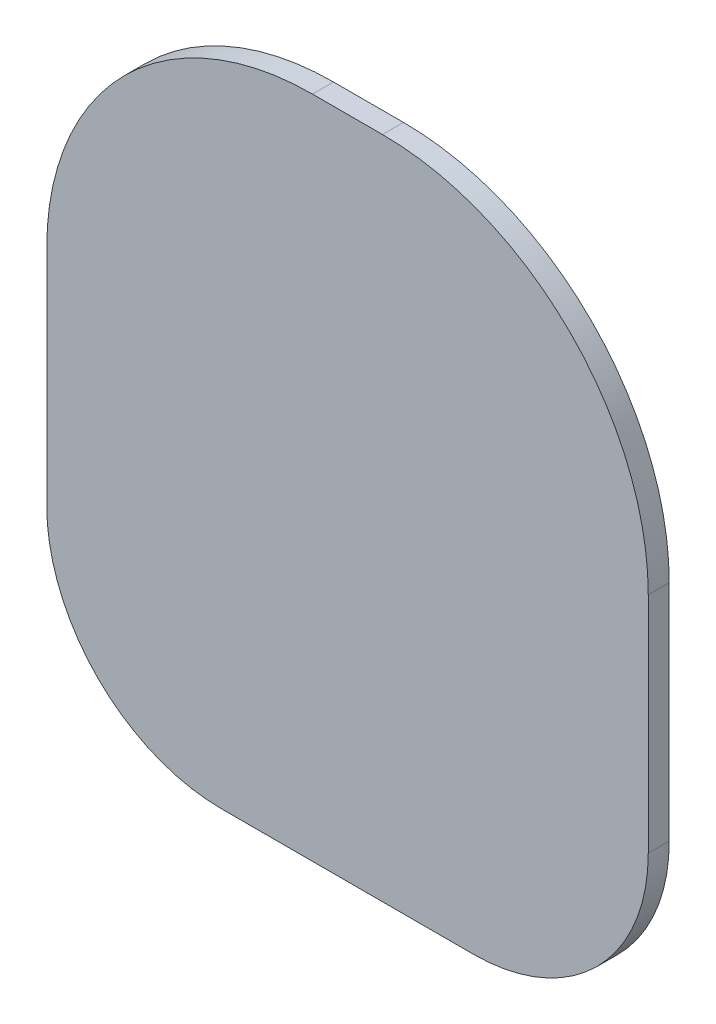
ISO-10303-21;
HEADER;
FILE_DESCRIPTION(('STEP AP214'),'2;1');
FILE_NAME('part.step','',(''),(''),'','','');
FILE_SCHEMA(('AUTOMOTIVE_DESIGN { 1 0 10303 214 1 1 1 1 }'));
ENDSEC;
DATA;
#1=APPLICATION_CONTEXT('core data for automotive mechanical design processes');
#2=APPLICATION_PROTOCOL_DEFINITION('international standard','automotive_design',2000,#1);
#3=PRODUCT_CONTEXT('',#1,'mechanical');
#4=PRODUCT('Part','Part','',(#3));
#5=PRODUCT_RELATED_PRODUCT_CATEGORY('part','',(#4));
#6=PRODUCT_DEFINITION_FORMATION('','',#4);
#7=PRODUCT_DEFINITION_CONTEXT('part definition',#1,'design');
#8=PRODUCT_DEFINITION('design','',#6,#7);
#9=PRODUCT_DEFINITION_SHAPE('','',#8);
#10=(LENGTH_UNIT() NAMED_UNIT(*) SI_UNIT(.MILLI.,.METRE.));
#11=(NAMED_UNIT(*) PLANE_ANGLE_UNIT() SI_UNIT($,.RADIAN.));
#12=(NAMED_UNIT(*) SI_UNIT($,.STERADIAN.) SOLID_ANGLE_UNIT());
#13=UNCERTAINTY_MEASURE_WITH_UNIT(LENGTH_MEASURE(1.E-05),#10,'distance_accuracy_value','');
#14=(GEOMETRIC_REPRESENTATION_CONTEXT(3) GLOBAL_UNCERTAINTY_ASSIGNED_CONTEXT((#13)) GLOBAL_UNIT_ASSIGNED_CONTEXT((#10,
#11,#12)) REPRESENTATION_CONTEXT('',''));
#15=CARTESIAN_POINT('',(0.,0.,0.));
#16=DIRECTION('',(0.,0.,1.));
#17=DIRECTION('',(1.,0.,0.));
#18=AXIS2_PLACEMENT_3D('',#15,#16,#17);
#19=CARTESIAN_POINT('',(-4.99999999999999,-29.5,3.));
#20=DIRECTION('',(0.,0.,-1.));
#21=DIRECTION('',(-1.,0.,0.));
#22=AXIS2_PLACEMENT_3D('',#19,#20,#21);
#23=CYLINDRICAL_SURFACE('',#22,38.);
#24=CARTESIAN_POINT('',(-4.99999999999999,-29.5,0.));
#25=DIRECTION('',(0.,0.,1.));
#26=DIRECTION('',(-1.,0.,0.));
#27=AXIS2_PLACEMENT_3D('',#24,#25,#26);
#28=CIRCLE('',#27,38.);
#29=CARTESIAN_POINT('',(-4.99999999999999,8.5,0.));
#30=VERTEX_POINT('',#29);
#31=CARTESIAN_POINT('',(-43.,-29.5,0.));
#32=VERTEX_POINT('',#31);
#33=EDGE_CURVE('E133',#30,#32,#28,.T.);
#34=ORIENTED_EDGE('',*,*,#33,.T.);
#35=DIRECTION('',(0.,0.,-1.));
#36=VECTOR('',#35,1.);
#37=CARTESIAN_POINT('',(-43.,-29.5,3.));
#38=LINE('',#37,#36);
#39=CARTESIAN_POINT('',(-43.,-29.5,3.));
#40=VERTEX_POINT('',#39);
#41=EDGE_CURVE('E11',#40,#32,#38,.T.);
#42=ORIENTED_EDGE('',*,*,#41,.F.);
#43=CARTESIAN_POINT('',(-4.99999999999999,-29.5,3.));
#44=DIRECTION('',(0.,0.,1.));
#45=DIRECTION('',(-1.,0.,0.));
#46=AXIS2_PLACEMENT_3D('',#43,#44,#45);
#47=CIRCLE('',#46,38.);
#48=CARTESIAN_POINT('',(-4.99999999999999,8.5,3.));
#49=VERTEX_POINT('',#48);
#50=EDGE_CURVE('E148',#49,#40,#47,.T.);
#51=ORIENTED_EDGE('',*,*,#50,.F.);
#52=DIRECTION('',(0.,0.,-1.));
#53=VECTOR('',#52,1.);
#54=CARTESIAN_POINT('',(-4.99999999999999,8.5,3.));
#55=LINE('',#54,#53);
#56=EDGE_CURVE('E129',#49,#30,#55,.T.);
#57=ORIENTED_EDGE('',*,*,#56,.T.);
#58=EDGE_LOOP('',(#34,#42,#51,#57));
#59=FACE_BOUND('',#58,.T.);
#60=ADVANCED_FACE('F37',(#59),#23,.T.);
#61=CARTESIAN_POINT('',(-43.,-29.5,3.));
#62=DIRECTION('',(1.,0.,0.));
#63=DIRECTION('',(0.,0.,-1.));
#64=AXIS2_PLACEMENT_3D('',#61,#62,#63);
#65=PLANE('',#64);
#66=DIRECTION('',(0.,-1.,0.));
#67=VECTOR('',#66,1.);
#68=CARTESIAN_POINT('',(-43.,-29.5,0.));
#69=LINE('',#68,#67);
#70=CARTESIAN_POINT('',(-43.,-61.5,0.));
#71=VERTEX_POINT('',#70);
#72=EDGE_CURVE('E136',#32,#71,#69,.T.);
#73=ORIENTED_EDGE('',*,*,#72,.T.);
#74=DIRECTION('',(0.,0.,-1.));
#75=VECTOR('',#74,1.);
#76=CARTESIAN_POINT('',(-43.,-61.5,3.));
#77=LINE('',#76,#75);
#78=CARTESIAN_POINT('',(-43.,-61.5,3.));
#79=VERTEX_POINT('',#78);
#80=EDGE_CURVE('E45',#79,#71,#77,.T.);
#81=ORIENTED_EDGE('',*,*,#80,.F.);
#82=DIRECTION('',(0.,-1.,0.));
#83=VECTOR('',#82,1.);
#84=CARTESIAN_POINT('',(-43.,-29.5,3.));
#85=LINE('',#84,#83);
#86=EDGE_CURVE('E96',#40,#79,#85,.T.);
#87=ORIENTED_EDGE('',*,*,#86,.F.);
#88=ORIENTED_EDGE('',*,*,#41,.T.);
#89=EDGE_LOOP('',(#73,#81,#87,#88));
#90=FACE_BOUND('',#89,.T.);
#91=ADVANCED_FACE('F182',(#90),#65,.F.);
#92=CARTESIAN_POINT('',(-18.,-61.5,3.));
#93=DIRECTION('',(0.,0.,-1.));
#94=DIRECTION('',(-1.,0.,0.));
#95=AXIS2_PLACEMENT_3D('',#92,#93,#94);
#96=CYLINDRICAL_SURFACE('',#95,25.);
#97=CARTESIAN_POINT('',(-18.,-61.5,0.));
#98=DIRECTION('',(0.,0.,1.));
#99=DIRECTION('',(1.,0.,0.));
#100=AXIS2_PLACEMENT_3D('',#97,#98,#99);
#101=CIRCLE('',#100,25.);
#102=CARTESIAN_POINT('',(-18.,-86.5,0.));
#103=VERTEX_POINT('',#102);
#104=EDGE_CURVE('E138',#71,#103,#101,.T.);
#105=ORIENTED_EDGE('',*,*,#104,.T.);
#106=DIRECTION('',(0.,0.,-1.));
#107=VECTOR('',#106,1.);
#108=CARTESIAN_POINT('',(-18.,-86.5,3.));
#109=LINE('',#108,#107);
#110=CARTESIAN_POINT('',(-18.,-86.5,3.));
#111=VERTEX_POINT('',#110);
#112=EDGE_CURVE('E155',#111,#103,#109,.T.);
#113=ORIENTED_EDGE('',*,*,#112,.F.);
#114=CARTESIAN_POINT('',(-18.,-61.5,3.));
#115=DIRECTION('',(0.,0.,1.));
#116=DIRECTION('',(1.,0.,0.));
#117=AXIS2_PLACEMENT_3D('',#114,#115,#116);
#118=CIRCLE('',#117,25.);
#119=EDGE_CURVE('E163',#79,#111,#118,.T.);
#120=ORIENTED_EDGE('',*,*,#119,.F.);
#121=ORIENTED_EDGE('',*,*,#80,.T.);
#122=EDGE_LOOP('',(#105,#113,#120,#121));
#123=FACE_BOUND('',#122,.T.);
#124=ADVANCED_FACE('F161',(#123),#96,.T.);
#125=CARTESIAN_POINT('',(0.500000000000011,-86.5,3.));
#126=DIRECTION('',(0.,1.,0.));
#127=DIRECTION('',(-1.,0.,0.));
#128=AXIS2_PLACEMENT_3D('',#125,#126,#127);
#129=PLANE('',#128);
#130=DIRECTION('',(1.,0.,0.));
#131=VECTOR('',#130,1.);
#132=CARTESIAN_POINT('',(0.500000000000011,-86.5,0.));
#133=LINE('',#132,#131);
#134=CARTESIAN_POINT('',(18.,-86.5,0.));
#135=VERTEX_POINT('',#134);
#136=EDGE_CURVE('E141',#103,#135,#133,.T.);
#137=ORIENTED_EDGE('',*,*,#136,.T.);
#138=DIRECTION('',(0.,0.,-1.));
#139=VECTOR('',#138,1.);
#140=CARTESIAN_POINT('',(18.,-86.5,3.));
#141=LINE('',#140,#139);
#142=CARTESIAN_POINT('',(18.,-86.5,3.));
#143=VERTEX_POINT('',#142);
#144=EDGE_CURVE('E152',#143,#135,#141,.T.);
#145=ORIENTED_EDGE('',*,*,#144,.F.);
#146=DIRECTION('',(1.,0.,0.));
#147=VECTOR('',#146,1.);
#148=CARTESIAN_POINT('',(-18.,-86.5,3.));
#149=LINE('',#148,#147);
#150=EDGE_CURVE('E174',#111,#143,#149,.T.);
#151=ORIENTED_EDGE('',*,*,#150,.F.);
#152=ORIENTED_EDGE('',*,*,#112,.T.);
#153=EDGE_LOOP('',(#137,#145,#151,#152));
#154=FACE_BOUND('',#153,.T.);
#155=ADVANCED_FACE('F170',(#154),#129,.F.);
#156=CARTESIAN_POINT('',(18.,-61.5,3.));
#157=DIRECTION('',(0.,0.,-1.));
#158=DIRECTION('',(-1.,0.,0.));
#159=AXIS2_PLACEMENT_3D('',#156,#157,#158);
#160=CYLINDRICAL_SURFACE('',#159,25.);
#161=CARTESIAN_POINT('',(18.,-61.5,0.));
#162=DIRECTION('',(0.,0.,1.));
#163=DIRECTION('',(1.,0.,0.));
#164=AXIS2_PLACEMENT_3D('',#161,#162,#163);
#165=CIRCLE('',#164,25.);
#166=CARTESIAN_POINT('',(43.,-61.5,0.));
#167=VERTEX_POINT('',#166);
#168=EDGE_CURVE('E143',#135,#167,#165,.T.);
#169=ORIENTED_EDGE('',*,*,#168,.T.);
#170=DIRECTION('',(0.,0.,-1.));
#171=VECTOR('',#170,1.);
#172=CARTESIAN_POINT('',(43.,-61.5,3.));
#173=LINE('',#172,#171);
#174=CARTESIAN_POINT('',(43.,-61.5,3.));
#175=VERTEX_POINT('',#174);
#176=EDGE_CURVE('E124',#175,#167,#173,.T.);
#177=ORIENTED_EDGE('',*,*,#176,.F.);
#178=CARTESIAN_POINT('',(18.,-61.5,3.));
#179=DIRECTION('',(0.,0.,1.));
#180=DIRECTION('',(1.,0.,0.));
#181=AXIS2_PLACEMENT_3D('',#178,#179,#180);
#182=CIRCLE('',#181,25.);
#183=EDGE_CURVE('E115',#143,#175,#182,.T.);
#184=ORIENTED_EDGE('',*,*,#183,.F.);
#185=ORIENTED_EDGE('',*,*,#144,.T.);
#186=EDGE_LOOP('',(#169,#177,#184,#185));
#187=FACE_BOUND('',#186,.T.);
#188=ADVANCED_FACE('F173',(#187),#160,.T.);
#189=CARTESIAN_POINT('',(43.,-29.5,3.));
#190=DIRECTION('',(-1.,0.,0.));
#191=DIRECTION('',(0.,0.,1.));
#192=AXIS2_PLACEMENT_3D('',#189,#190,#191);
#193=PLANE('',#192);
#194=DIRECTION('',(0.,1.,0.));
#195=VECTOR('',#194,1.);
#196=CARTESIAN_POINT('',(43.,-29.5,0.));
#197=LINE('',#196,#195);
#198=CARTESIAN_POINT('',(43.,-29.5,0.));
#199=VERTEX_POINT('',#198);
#200=EDGE_CURVE('E123',#167,#199,#197,.T.);
#201=ORIENTED_EDGE('',*,*,#200,.T.);
#202=DIRECTION('',(0.,0.,-1.));
#203=VECTOR('',#202,1.);
#204=CARTESIAN_POINT('',(43.,-29.5,3.));
#205=LINE('',#204,#203);
#206=CARTESIAN_POINT('',(43.,-29.5,3.));
#207=VERTEX_POINT('',#206);
#208=EDGE_CURVE('E120',#207,#199,#205,.T.);
#209=ORIENTED_EDGE('',*,*,#208,.F.);
#210=DIRECTION('',(0.,1.,0.));
#211=VECTOR('',#210,1.);
#212=CARTESIAN_POINT('',(43.,-29.5,3.));
#213=LINE('',#212,#211);
#214=EDGE_CURVE('E109',#175,#207,#213,.T.);
#215=ORIENTED_EDGE('',*,*,#214,.F.);
#216=ORIENTED_EDGE('',*,*,#176,.T.);
#217=EDGE_LOOP('',(#201,#209,#215,#216));
#218=FACE_BOUND('',#217,.T.);
#219=ADVANCED_FACE('F121',(#218),#193,.F.);
#220=CARTESIAN_POINT('',(5.,-29.5,3.));
#221=DIRECTION('',(0.,0.,-1.));
#222=DIRECTION('',(-1.,0.,0.));
#223=AXIS2_PLACEMENT_3D('',#220,#221,#222);
#224=CYLINDRICAL_SURFACE('',#223,38.);
#225=CARTESIAN_POINT('',(5.,-29.5,0.));
#226=DIRECTION('',(0.,0.,1.));
#227=DIRECTION('',(-1.,0.,0.));
#228=AXIS2_PLACEMENT_3D('',#225,#226,#227);
#229=CIRCLE('',#228,38.);
#230=CARTESIAN_POINT('',(5.,8.50000000000001,0.));
#231=VERTEX_POINT('',#230);
#232=EDGE_CURVE('E82',#199,#231,#229,.T.);
#233=ORIENTED_EDGE('',*,*,#232,.T.);
#234=DIRECTION('',(0.,0.,-1.));
#235=VECTOR('',#234,1.);
#236=CARTESIAN_POINT('',(5.,8.50000000000001,3.));
#237=LINE('',#236,#235);
#238=CARTESIAN_POINT('',(5.,8.50000000000001,3.));
#239=VERTEX_POINT('',#238);
#240=EDGE_CURVE('E125',#239,#231,#237,.T.);
#241=ORIENTED_EDGE('',*,*,#240,.F.);
#242=CARTESIAN_POINT('',(5.,-29.5,3.));
#243=DIRECTION('',(0.,0.,1.));
#244=DIRECTION('',(-1.,0.,0.));
#245=AXIS2_PLACEMENT_3D('',#242,#243,#244);
#246=CIRCLE('',#245,38.);
#247=EDGE_CURVE('E113',#207,#239,#246,.T.);
#248=ORIENTED_EDGE('',*,*,#247,.F.);
#249=ORIENTED_EDGE('',*,*,#208,.T.);
#250=EDGE_LOOP('',(#233,#241,#248,#249));
#251=FACE_BOUND('',#250,.T.);
#252=ADVANCED_FACE('F127',(#251),#224,.T.);
#253=CARTESIAN_POINT('',(-4.99999999999999,8.5,3.));
#254=DIRECTION('',(0.,-1.,0.));
#255=DIRECTION('',(1.,0.,0.));
#256=AXIS2_PLACEMENT_3D('',#253,#254,#255);
#257=PLANE('',#256);
#258=DIRECTION('',(-1.,0.,0.));
#259=VECTOR('',#258,1.);
#260=CARTESIAN_POINT('',(-4.99999999999999,8.5,0.));
#261=LINE('',#260,#259);
#262=EDGE_CURVE('E88',#231,#30,#261,.T.);
#263=ORIENTED_EDGE('',*,*,#262,.T.);
#264=ORIENTED_EDGE('',*,*,#56,.F.);
#265=DIRECTION('',(-1.,0.,0.));
#266=VECTOR('',#265,1.);
#267=CARTESIAN_POINT('',(-4.99999999999999,8.5,3.));
#268=LINE('',#267,#266);
#269=EDGE_CURVE('E53',#239,#49,#268,.T.);
#270=ORIENTED_EDGE('',*,*,#269,.F.);
#271=ORIENTED_EDGE('',*,*,#240,.T.);
#272=EDGE_LOOP('',(#263,#264,#270,#271));
#273=FACE_BOUND('',#272,.T.);
#274=ADVANCED_FACE('F198',(#273),#257,.F.);
#275=CARTESIAN_POINT('',(-4.99999999999999,-29.5,3.));
#276=DIRECTION('',(0.,0.,-1.));
#277=DIRECTION('',(-1.,0.,0.));
#278=AXIS2_PLACEMENT_3D('',#275,#276,#277);
#279=PLANE('',#278);
#280=ORIENTED_EDGE('',*,*,#50,.T.);
#281=ORIENTED_EDGE('',*,*,#86,.T.);
#282=ORIENTED_EDGE('',*,*,#119,.T.);
#283=ORIENTED_EDGE('',*,*,#150,.T.);
#284=ORIENTED_EDGE('',*,*,#183,.T.);
#285=ORIENTED_EDGE('',*,*,#214,.T.);
#286=ORIENTED_EDGE('',*,*,#247,.T.);
#287=ORIENTED_EDGE('',*,*,#269,.T.);
#288=EDGE_LOOP('',(#280,#281,#282,#283,#284,#285,#286,#287));
#289=FACE_BOUND('',#288,.T.);
#290=ADVANCED_FACE('F111',(#289),#279,.F.);
#291=CARTESIAN_POINT('',(-4.99999999999999,-29.5,0.));
#292=DIRECTION('',(0.,0.,-1.));
#293=DIRECTION('',(-1.,0.,0.));
#294=AXIS2_PLACEMENT_3D('',#291,#292,#293);
#295=PLANE('',#294);
#296=ORIENTED_EDGE('',*,*,#33,.F.);
#297=ORIENTED_EDGE('',*,*,#262,.F.);
#298=ORIENTED_EDGE('',*,*,#232,.F.);
#299=ORIENTED_EDGE('',*,*,#200,.F.);
#300=ORIENTED_EDGE('',*,*,#168,.F.);
#301=ORIENTED_EDGE('',*,*,#136,.F.);
#302=ORIENTED_EDGE('',*,*,#104,.F.);
#303=ORIENTED_EDGE('',*,*,#72,.F.);
#304=EDGE_LOOP('',(#296,#297,#298,#299,#300,#301,#302,#303));
#305=FACE_BOUND('',#304,.T.);
#306=ADVANCED_FACE('F166',(#305),#295,.T.);
#307=CLOSED_SHELL('',(#60,#91,#124,#155,#188,#219,#252,#274,#290,#306));
#308=MANIFOLD_SOLID_BREP('B2',#307);
#309=ADVANCED_BREP_SHAPE_REPRESENTATION('',(#18,#308),#14);
#310=SHAPE_DEFINITION_REPRESENTATION(#9,#309);
ENDSEC;
END-ISO-10303-21;
